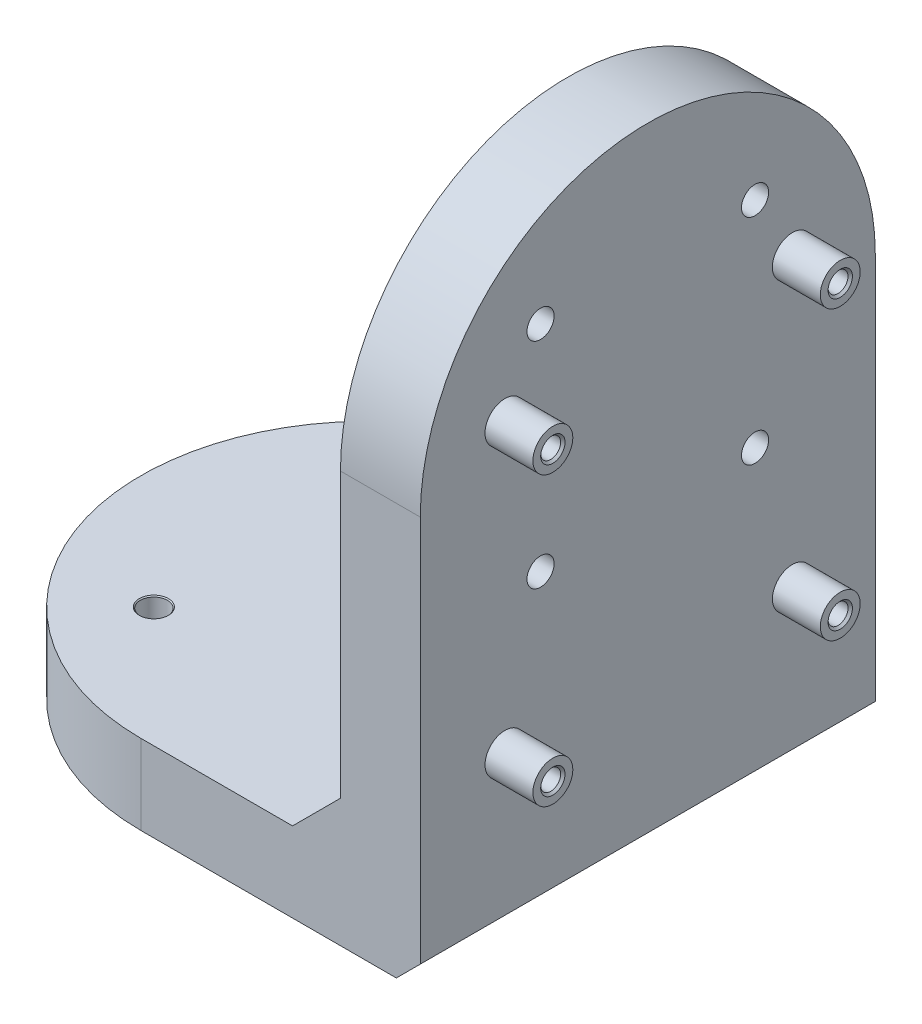
ISO-10303-21;
HEADER;
FILE_DESCRIPTION(('STEP AP214'),'2;1');
FILE_NAME('part.step','',(''),(''),'','','');
FILE_SCHEMA(('AUTOMOTIVE_DESIGN { 1 0 10303 214 1 1 1 1 }'));
ENDSEC;
DATA;
#1=APPLICATION_CONTEXT('core data for automotive mechanical design processes');
#2=APPLICATION_PROTOCOL_DEFINITION('international standard','automotive_design',2000,#1);
#3=PRODUCT_CONTEXT('',#1,'mechanical');
#4=PRODUCT('Part','Part','',(#3));
#5=PRODUCT_RELATED_PRODUCT_CATEGORY('part','',(#4));
#6=PRODUCT_DEFINITION_FORMATION('','',#4);
#7=PRODUCT_DEFINITION_CONTEXT('part definition',#1,'design');
#8=PRODUCT_DEFINITION('design','',#6,#7);
#9=PRODUCT_DEFINITION_SHAPE('','',#8);
#10=(LENGTH_UNIT() NAMED_UNIT(*) SI_UNIT(.MILLI.,.METRE.));
#11=(NAMED_UNIT(*) PLANE_ANGLE_UNIT() SI_UNIT($,.RADIAN.));
#12=(NAMED_UNIT(*) SI_UNIT($,.STERADIAN.) SOLID_ANGLE_UNIT());
#13=UNCERTAINTY_MEASURE_WITH_UNIT(LENGTH_MEASURE(1.E-05),#10,'distance_accuracy_value','');
#14=(GEOMETRIC_REPRESENTATION_CONTEXT(3) GLOBAL_UNCERTAINTY_ASSIGNED_CONTEXT((#13)) GLOBAL_UNIT_ASSIGNED_CONTEXT((#10,
#11,#12)) REPRESENTATION_CONTEXT('',''));
#15=CARTESIAN_POINT('',(0.,0.,0.));
#16=DIRECTION('',(0.,0.,1.));
#17=DIRECTION('',(1.,0.,0.));
#18=AXIS2_PLACEMENT_3D('',#15,#16,#17);
#19=CARTESIAN_POINT('',(25.,80.,0.));
#20=DIRECTION('',(1.,0.,0.));
#21=DIRECTION('',(0.,0.,-1.));
#22=AXIS2_PLACEMENT_3D('',#19,#20,#21);
#23=PLANE('',#22);
#24=CARTESIAN_POINT('',(25.,38.0649711574556,-13.4350288425444));
#25=DIRECTION('',(-1.,0.,0.));
#26=DIRECTION('',(0.,0.,1.));
#27=AXIS2_PLACEMENT_3D('',#24,#25,#26);
#28=CIRCLE('',#27,1.825);
#29=CARTESIAN_POINT('',(25.,38.0649711574556,-11.6100288425444));
#30=VERTEX_POINT('',#29);
#31=EDGE_CURVE('E233',#30,#30,#28,.T.);
#32=ORIENTED_EDGE('',*,*,#31,.F.);
#33=EDGE_LOOP('',(#32));
#34=FACE_BOUND('',#33,.T.);
#35=CARTESIAN_POINT('',(25.,64.9350288425443,-13.4350288425445));
#36=DIRECTION('',(-1.,0.,0.));
#37=DIRECTION('',(0.,0.,1.));
#38=AXIS2_PLACEMENT_3D('',#35,#36,#37);
#39=CIRCLE('',#38,1.82500000000001);
#40=CARTESIAN_POINT('',(25.,64.9350288425443,-11.6100288425445));
#41=VERTEX_POINT('',#40);
#42=EDGE_CURVE('E245',#41,#41,#39,.T.);
#43=ORIENTED_EDGE('',*,*,#42,.F.);
#44=EDGE_LOOP('',(#43));
#45=FACE_BOUND('',#44,.T.);
#46=CARTESIAN_POINT('',(25.,64.9350288425444,13.4350288425444));
#47=DIRECTION('',(-1.,0.,0.));
#48=DIRECTION('',(0.,0.,1.));
#49=AXIS2_PLACEMENT_3D('',#46,#47,#48);
#50=CIRCLE('',#49,1.82499999999999);
#51=CARTESIAN_POINT('',(25.,64.9350288425444,15.2600288425444));
#52=VERTEX_POINT('',#51);
#53=EDGE_CURVE('E257',#52,#52,#50,.T.);
#54=ORIENTED_EDGE('',*,*,#53,.F.);
#55=EDGE_LOOP('',(#54));
#56=FACE_BOUND('',#55,.T.);
#57=DIRECTION('',(0.,-1.,0.));
#58=VECTOR('',#57,1.);
#59=CARTESIAN_POINT('',(25.,80.,-28.5));
#60=LINE('',#59,#58);
#61=CARTESIAN_POINT('',(25.,51.5,-28.5));
#62=VERTEX_POINT('',#61);
#63=CARTESIAN_POINT('',(25.,16.0000000000001,-28.5));
#64=VERTEX_POINT('',#63);
#65=EDGE_CURVE('E342',#62,#64,#60,.T.);
#66=ORIENTED_EDGE('',*,*,#65,.T.);
#67=DIRECTION('',(0.,0.,1.));
#68=VECTOR('',#67,1.);
#69=CARTESIAN_POINT('',(25.,16.0000000000001,0.));
#70=LINE('',#69,#68);
#71=CARTESIAN_POINT('',(25.,16.0000000000001,28.5));
#72=VERTEX_POINT('',#71);
#73=EDGE_CURVE('E387',#64,#72,#70,.T.);
#74=ORIENTED_EDGE('',*,*,#73,.T.);
#75=DIRECTION('',(0.,-1.,0.));
#76=VECTOR('',#75,1.);
#77=CARTESIAN_POINT('',(25.,80.,28.5));
#78=LINE('',#77,#76);
#79=CARTESIAN_POINT('',(25.,51.5,28.5));
#80=VERTEX_POINT('',#79);
#81=EDGE_CURVE('E339',#80,#72,#78,.T.);
#82=ORIENTED_EDGE('',*,*,#81,.F.);
#83=CARTESIAN_POINT('',(25.,51.5,0.));
#84=DIRECTION('',(-1.,0.,0.));
#85=DIRECTION('',(0.,0.,1.));
#86=AXIS2_PLACEMENT_3D('',#83,#84,#85);
#87=CIRCLE('',#86,28.5);
#88=EDGE_CURVE('E276',#80,#62,#87,.T.);
#89=ORIENTED_EDGE('',*,*,#88,.T.);
#90=EDGE_LOOP('',(#66,#74,#82,#89));
#91=FACE_BOUND('',#90,.T.);
#92=CARTESIAN_POINT('',(25.,38.0649711574558,13.4350288425446));
#93=DIRECTION('',(-1.,0.,0.));
#94=DIRECTION('',(0.,0.,1.));
#95=AXIS2_PLACEMENT_3D('',#92,#93,#94);
#96=CIRCLE('',#95,1.825);
#97=CARTESIAN_POINT('',(25.,38.0649711574558,15.2600288425446));
#98=VERTEX_POINT('',#97);
#99=EDGE_CURVE('E218',#98,#98,#96,.T.);
#100=ORIENTED_EDGE('',*,*,#99,.F.);
#101=EDGE_LOOP('',(#100));
#102=FACE_BOUND('',#101,.T.);
#103=ADVANCED_FACE('F58',(#34,#45,#56,#91,#102),#23,.F.);
#104=CARTESIAN_POINT('',(35.,80.,0.));
#105=DIRECTION('',(1.,0.,0.));
#106=DIRECTION('',(0.,0.,-1.));
#107=AXIS2_PLACEMENT_3D('',#104,#105,#106);
#108=PLANE('',#107);
#109=CARTESIAN_POINT('',(35.,20.5570503949516,17.8917145880082));
#110=DIRECTION('',(1.,0.,0.));
#111=DIRECTION('',(0.,0.,-1.));
#112=AXIS2_PLACEMENT_3D('',#109,#110,#111);
#113=CIRCLE('',#112,2.5);
#114=CARTESIAN_POINT('',(35.,20.5570503949516,15.3917145880082));
#115=VERTEX_POINT('',#114);
#116=EDGE_CURVE('E190',#115,#115,#113,.T.);
#117=ORIENTED_EDGE('',*,*,#116,.F.);
#118=EDGE_LOOP('',(#117));
#119=FACE_BOUND('',#118,.T.);
#120=CARTESIAN_POINT('',(35.,20.5570503949516,-18.1082854119918));
#121=DIRECTION('',(1.,0.,0.));
#122=DIRECTION('',(0.,0.,-1.));
#123=AXIS2_PLACEMENT_3D('',#120,#121,#122);
#124=CIRCLE('',#123,2.5);
#125=CARTESIAN_POINT('',(35.,20.5570503949516,-20.6082854119918));
#126=VERTEX_POINT('',#125);
#127=EDGE_CURVE('E198',#126,#126,#124,.T.);
#128=ORIENTED_EDGE('',*,*,#127,.F.);
#129=EDGE_LOOP('',(#128));
#130=FACE_BOUND('',#129,.T.);
#131=CARTESIAN_POINT('',(35.,56.5570503949516,-18.1082854119914));
#132=DIRECTION('',(1.,0.,0.));
#133=DIRECTION('',(0.,0.,-1.));
#134=AXIS2_PLACEMENT_3D('',#131,#132,#133);
#135=CIRCLE('',#134,2.5);
#136=CARTESIAN_POINT('',(35.,56.5570503949516,-20.6082854119914));
#137=VERTEX_POINT('',#136);
#138=EDGE_CURVE('E206',#137,#137,#135,.T.);
#139=ORIENTED_EDGE('',*,*,#138,.F.);
#140=EDGE_LOOP('',(#139));
#141=FACE_BOUND('',#140,.T.);
#142=CARTESIAN_POINT('',(35.,56.5570503949516,17.8917145880085));
#143=DIRECTION('',(1.,0.,0.));
#144=DIRECTION('',(0.,0.,-1.));
#145=AXIS2_PLACEMENT_3D('',#142,#143,#144);
#146=CIRCLE('',#145,2.5);
#147=CARTESIAN_POINT('',(35.,56.5570503949516,15.3917145880085));
#148=VERTEX_POINT('',#147);
#149=EDGE_CURVE('E210',#148,#148,#146,.T.);
#150=ORIENTED_EDGE('',*,*,#149,.F.);
#151=EDGE_LOOP('',(#150));
#152=FACE_BOUND('',#151,.T.);
#153=CARTESIAN_POINT('',(35.,38.0649711574558,13.4350288425446));
#154=DIRECTION('',(1.,0.,0.));
#155=DIRECTION('',(0.,0.,-1.));
#156=AXIS2_PLACEMENT_3D('',#153,#154,#155);
#157=CIRCLE('',#156,1.69999999999999);
#158=CARTESIAN_POINT('',(35.,38.0649711574558,11.7350288425446));
#159=VERTEX_POINT('',#158);
#160=EDGE_CURVE('E229',#159,#159,#157,.T.);
#161=ORIENTED_EDGE('',*,*,#160,.F.);
#162=EDGE_LOOP('',(#161));
#163=FACE_BOUND('',#162,.T.);
#164=CARTESIAN_POINT('',(35.,38.0649711574556,-13.4350288425444));
#165=DIRECTION('',(1.,0.,0.));
#166=DIRECTION('',(0.,0.,-1.));
#167=AXIS2_PLACEMENT_3D('',#164,#165,#166);
#168=CIRCLE('',#167,1.69999999999999);
#169=CARTESIAN_POINT('',(35.,38.0649711574556,-15.1350288425444));
#170=VERTEX_POINT('',#169);
#171=EDGE_CURVE('E241',#170,#170,#168,.T.);
#172=ORIENTED_EDGE('',*,*,#171,.F.);
#173=EDGE_LOOP('',(#172));
#174=FACE_BOUND('',#173,.T.);
#175=CARTESIAN_POINT('',(35.,64.9350288425443,-13.4350288425445));
#176=DIRECTION('',(1.,0.,0.));
#177=DIRECTION('',(0.,0.,-1.));
#178=AXIS2_PLACEMENT_3D('',#175,#176,#177);
#179=CIRCLE('',#178,1.69999999999999);
#180=CARTESIAN_POINT('',(35.,64.9350288425443,-15.1350288425445));
#181=VERTEX_POINT('',#180);
#182=EDGE_CURVE('E253',#181,#181,#179,.T.);
#183=ORIENTED_EDGE('',*,*,#182,.F.);
#184=EDGE_LOOP('',(#183));
#185=FACE_BOUND('',#184,.T.);
#186=CARTESIAN_POINT('',(35.,64.9350288425444,13.4350288425444));
#187=DIRECTION('',(1.,0.,0.));
#188=DIRECTION('',(0.,0.,-1.));
#189=AXIS2_PLACEMENT_3D('',#186,#187,#188);
#190=CIRCLE('',#189,1.69999999999999);
#191=CARTESIAN_POINT('',(35.,64.9350288425444,11.7350288425444));
#192=VERTEX_POINT('',#191);
#193=EDGE_CURVE('E265',#192,#192,#190,.T.);
#194=ORIENTED_EDGE('',*,*,#193,.F.);
#195=EDGE_LOOP('',(#194));
#196=FACE_BOUND('',#195,.T.);
#197=DIRECTION('',(0.,-1.,0.));
#198=VECTOR('',#197,1.);
#199=CARTESIAN_POINT('',(35.,80.,28.5));
#200=LINE('',#199,#198);
#201=CARTESIAN_POINT('',(35.,51.5,28.5));
#202=VERTEX_POINT('',#201);
#203=CARTESIAN_POINT('',(35.,3.00000000000003,28.5));
#204=VERTEX_POINT('',#203);
#205=EDGE_CURVE('E335',#202,#204,#200,.T.);
#206=ORIENTED_EDGE('',*,*,#205,.T.);
#207=DIRECTION('',(0.,0.,-1.));
#208=VECTOR('',#207,1.);
#209=CARTESIAN_POINT('',(35.,3.00000000000003,-28.5));
#210=LINE('',#209,#208);
#211=CARTESIAN_POINT('',(35.,3.00000000000003,-28.5));
#212=VERTEX_POINT('',#211);
#213=EDGE_CURVE('E381',#204,#212,#210,.T.);
#214=ORIENTED_EDGE('',*,*,#213,.T.);
#215=DIRECTION('',(0.,-1.,0.));
#216=VECTOR('',#215,1.);
#217=CARTESIAN_POINT('',(35.,80.,-28.5));
#218=LINE('',#217,#216);
#219=CARTESIAN_POINT('',(35.,51.5,-28.5));
#220=VERTEX_POINT('',#219);
#221=EDGE_CURVE('E331',#220,#212,#218,.T.);
#222=ORIENTED_EDGE('',*,*,#221,.F.);
#223=CARTESIAN_POINT('',(35.,51.5,0.));
#224=DIRECTION('',(1.,0.,0.));
#225=DIRECTION('',(0.,0.,-1.));
#226=AXIS2_PLACEMENT_3D('',#223,#224,#225);
#227=CIRCLE('',#226,28.5);
#228=EDGE_CURVE('E273',#202,#220,#227,.F.);
#229=ORIENTED_EDGE('',*,*,#228,.F.);
#230=EDGE_LOOP('',(#206,#214,#222,#229));
#231=FACE_BOUND('',#230,.T.);
#232=ADVANCED_FACE('F424',(#119,#130,#141,#152,#163,#174,#185,#196,#231),#108,.T.);
#233=CARTESIAN_POINT('',(0.,10.,28.5));
#234=DIRECTION('',(0.,0.,1.));
#235=DIRECTION('',(1.,0.,0.));
#236=AXIS2_PLACEMENT_3D('',#233,#234,#235);
#237=PLANE('',#236);
#238=DIRECTION('',(-1.,0.,0.));
#239=VECTOR('',#238,1.);
#240=CARTESIAN_POINT('',(0.,0.,28.5));
#241=LINE('',#240,#239);
#242=CARTESIAN_POINT('',(32.,0.,28.5));
#243=VERTEX_POINT('',#242);
#244=CARTESIAN_POINT('',(0.,0.,28.5));
#245=VERTEX_POINT('',#244);
#246=EDGE_CURVE('E351',#243,#245,#241,.T.);
#247=ORIENTED_EDGE('',*,*,#246,.F.);
#248=DIRECTION('',(0.707106781186544,0.707106781186551,0.));
#249=VECTOR('',#248,1.);
#250=CARTESIAN_POINT('',(21.0000000000001,-10.9999999999999,28.5));
#251=LINE('',#250,#249);
#252=EDGE_CURVE('E378',#243,#204,#251,.T.);
#253=ORIENTED_EDGE('',*,*,#252,.T.);
#254=ORIENTED_EDGE('',*,*,#205,.F.);
#255=DIRECTION('',(-1.,0.,0.));
#256=VECTOR('',#255,1.);
#257=CARTESIAN_POINT('',(35.001,51.5,28.5));
#258=LINE('',#257,#256);
#259=EDGE_CURVE('E269',#202,#80,#258,.T.);
#260=ORIENTED_EDGE('',*,*,#259,.T.);
#261=ORIENTED_EDGE('',*,*,#81,.T.);
#262=DIRECTION('',(-0.707106781186542,-0.707106781186553,0.));
#263=VECTOR('',#262,1.);
#264=CARTESIAN_POINT('',(25.,16.0000000000001,28.5));
#265=LINE('',#264,#263);
#266=CARTESIAN_POINT('',(19.,10.,28.5));
#267=VERTEX_POINT('',#266);
#268=EDGE_CURVE('E68',#72,#267,#265,.T.);
#269=ORIENTED_EDGE('',*,*,#268,.T.);
#270=DIRECTION('',(-1.,0.,0.));
#271=VECTOR('',#270,1.);
#272=CARTESIAN_POINT('',(0.,10.,28.5));
#273=LINE('',#272,#271);
#274=CARTESIAN_POINT('',(0.,10.,28.5));
#275=VERTEX_POINT('',#274);
#276=EDGE_CURVE('E355',#267,#275,#273,.T.);
#277=ORIENTED_EDGE('',*,*,#276,.T.);
#278=DIRECTION('',(0.,-1.,0.));
#279=VECTOR('',#278,1.);
#280=CARTESIAN_POINT('',(0.,10.,28.5));
#281=LINE('',#280,#279);
#282=EDGE_CURVE('E358',#275,#245,#281,.T.);
#283=ORIENTED_EDGE('',*,*,#282,.T.);
#284=EDGE_LOOP('',(#247,#253,#254,#260,#261,#269,#277,#283));
#285=FACE_BOUND('',#284,.T.);
#286=ADVANCED_FACE('F401',(#285),#237,.T.);
#287=CARTESIAN_POINT('',(0.,10.,-28.5));
#288=DIRECTION('',(0.,0.,-1.));
#289=DIRECTION('',(-1.,0.,0.));
#290=AXIS2_PLACEMENT_3D('',#287,#288,#289);
#291=PLANE('',#290);
#292=ORIENTED_EDGE('',*,*,#221,.T.);
#293=DIRECTION('',(-0.707106781186544,-0.707106781186551,0.));
#294=VECTOR('',#293,1.);
#295=CARTESIAN_POINT('',(21.0000000000001,-10.9999999999999,-28.5));
#296=LINE('',#295,#294);
#297=CARTESIAN_POINT('',(32.,0.,-28.5));
#298=VERTEX_POINT('',#297);
#299=EDGE_CURVE('E384',#212,#298,#296,.T.);
#300=ORIENTED_EDGE('',*,*,#299,.T.);
#301=DIRECTION('',(1.,0.,0.));
#302=VECTOR('',#301,1.);
#303=CARTESIAN_POINT('',(0.,0.,-28.5));
#304=LINE('',#303,#302);
#305=CARTESIAN_POINT('',(0.,0.,-28.5));
#306=VERTEX_POINT('',#305);
#307=EDGE_CURVE('E346',#306,#298,#304,.T.);
#308=ORIENTED_EDGE('',*,*,#307,.F.);
#309=DIRECTION('',(0.,-1.,0.));
#310=VECTOR('',#309,1.);
#311=CARTESIAN_POINT('',(0.,10.,-28.5));
#312=LINE('',#311,#310);
#313=CARTESIAN_POINT('',(0.,10.,-28.5));
#314=VERTEX_POINT('',#313);
#315=EDGE_CURVE('E371',#314,#306,#312,.T.);
#316=ORIENTED_EDGE('',*,*,#315,.F.);
#317=DIRECTION('',(1.,0.,0.));
#318=VECTOR('',#317,1.);
#319=CARTESIAN_POINT('',(0.,10.,-28.5));
#320=LINE('',#319,#318);
#321=CARTESIAN_POINT('',(19.,10.,-28.5));
#322=VERTEX_POINT('',#321);
#323=EDGE_CURVE('E347',#314,#322,#320,.T.);
#324=ORIENTED_EDGE('',*,*,#323,.T.);
#325=DIRECTION('',(0.707106781186542,0.707106781186553,0.));
#326=VECTOR('',#325,1.);
#327=CARTESIAN_POINT('',(25.,16.0000000000001,-28.5));
#328=LINE('',#327,#326);
#329=EDGE_CURVE('E11',#322,#64,#328,.T.);
#330=ORIENTED_EDGE('',*,*,#329,.T.);
#331=ORIENTED_EDGE('',*,*,#65,.F.);
#332=DIRECTION('',(-1.,0.,0.));
#333=VECTOR('',#332,1.);
#334=CARTESIAN_POINT('',(35.001,51.5,-28.5));
#335=LINE('',#334,#333);
#336=EDGE_CURVE('E280',#220,#62,#335,.T.);
#337=ORIENTED_EDGE('',*,*,#336,.F.);
#338=EDGE_LOOP('',(#292,#300,#308,#316,#324,#330,#331,#337));
#339=FACE_BOUND('',#338,.T.);
#340=ADVANCED_FACE('F408',(#339),#291,.T.);
#341=CARTESIAN_POINT('',(0.,10.,0.));
#342=DIRECTION('',(0.,-1.,0.));
#343=DIRECTION('',(0.,0.,-1.));
#344=AXIS2_PLACEMENT_3D('',#341,#342,#343);
#345=CYLINDRICAL_SURFACE('',#344,28.5);
#346=CARTESIAN_POINT('',(0.,0.,0.));
#347=DIRECTION('',(0.,1.,0.));
#348=DIRECTION('',(0.,0.,1.));
#349=AXIS2_PLACEMENT_3D('',#346,#347,#348);
#350=CIRCLE('',#349,28.5);
#351=EDGE_CURVE('E362',#306,#245,#350,.T.);
#352=ORIENTED_EDGE('',*,*,#351,.T.);
#353=ORIENTED_EDGE('',*,*,#282,.F.);
#354=CARTESIAN_POINT('',(0.,10.,0.));
#355=DIRECTION('',(0.,1.,0.));
#356=DIRECTION('',(0.,0.,1.));
#357=AXIS2_PLACEMENT_3D('',#354,#355,#356);
#358=CIRCLE('',#357,28.5);
#359=EDGE_CURVE('E350',#314,#275,#358,.T.);
#360=ORIENTED_EDGE('',*,*,#359,.F.);
#361=ORIENTED_EDGE('',*,*,#315,.T.);
#362=EDGE_LOOP('',(#352,#353,#360,#361));
#363=FACE_BOUND('',#362,.T.);
#364=ADVANCED_FACE('F439',(#363),#345,.T.);
#365=CARTESIAN_POINT('',(0.,10.,0.));
#366=DIRECTION('',(0.,1.,0.));
#367=DIRECTION('',(0.,0.,1.));
#368=AXIS2_PLACEMENT_3D('',#365,#366,#367);
#369=PLANE('',#368);
#370=CARTESIAN_POINT('',(13.4350288425444,10.,-13.4350288425444));
#371=DIRECTION('',(0.,1.,0.));
#372=DIRECTION('',(0.,0.,1.));
#373=AXIS2_PLACEMENT_3D('',#370,#371,#372);
#374=CIRCLE('',#373,1.825);
#375=CARTESIAN_POINT('',(13.4350288425444,10.,-11.6100288425444));
#376=VERTEX_POINT('',#375);
#377=EDGE_CURVE('E283',#376,#376,#374,.T.);
#378=ORIENTED_EDGE('',*,*,#377,.F.);
#379=EDGE_LOOP('',(#378));
#380=FACE_BOUND('',#379,.T.);
#381=CARTESIAN_POINT('',(13.4350288425452,10.,13.4350288425444));
#382=DIRECTION('',(0.,1.,0.));
#383=DIRECTION('',(0.,0.,1.));
#384=AXIS2_PLACEMENT_3D('',#381,#382,#383);
#385=CIRCLE('',#384,1.825);
#386=CARTESIAN_POINT('',(13.4350288425452,10.,15.2600288425444));
#387=VERTEX_POINT('',#386);
#388=EDGE_CURVE('E295',#387,#387,#385,.T.);
#389=ORIENTED_EDGE('',*,*,#388,.F.);
#390=EDGE_LOOP('',(#389));
#391=FACE_BOUND('',#390,.T.);
#392=CARTESIAN_POINT('',(-13.4350288425436,10.,13.4350288425452));
#393=DIRECTION('',(0.,1.,0.));
#394=DIRECTION('',(0.,0.,1.));
#395=AXIS2_PLACEMENT_3D('',#392,#393,#394);
#396=CIRCLE('',#395,1.825);
#397=CARTESIAN_POINT('',(-13.4350288425436,10.,15.2600288425452));
#398=VERTEX_POINT('',#397);
#399=EDGE_CURVE('E307',#398,#398,#396,.T.);
#400=ORIENTED_EDGE('',*,*,#399,.F.);
#401=EDGE_LOOP('',(#400));
#402=FACE_BOUND('',#401,.T.);
#403=CARTESIAN_POINT('',(-13.4350288425444,10.,-13.4350288425436));
#404=DIRECTION('',(0.,1.,0.));
#405=DIRECTION('',(0.,0.,1.));
#406=AXIS2_PLACEMENT_3D('',#403,#404,#405);
#407=CIRCLE('',#406,1.825);
#408=CARTESIAN_POINT('',(-13.4350288425444,10.,-11.6100288425436));
#409=VERTEX_POINT('',#408);
#410=EDGE_CURVE('E319',#409,#409,#407,.T.);
#411=ORIENTED_EDGE('',*,*,#410,.F.);
#412=EDGE_LOOP('',(#411));
#413=FACE_BOUND('',#412,.T.);
#414=ORIENTED_EDGE('',*,*,#276,.F.);
#415=DIRECTION('',(0.,0.,-1.));
#416=VECTOR('',#415,1.);
#417=CARTESIAN_POINT('',(19.,10.,0.));
#418=LINE('',#417,#416);
#419=EDGE_CURVE('E81',#267,#322,#418,.T.);
#420=ORIENTED_EDGE('',*,*,#419,.T.);
#421=ORIENTED_EDGE('',*,*,#323,.F.);
#422=ORIENTED_EDGE('',*,*,#359,.T.);
#423=EDGE_LOOP('',(#414,#420,#421,#422));
#424=FACE_BOUND('',#423,.T.);
#425=ADVANCED_FACE('F436',(#380,#391,#402,#413,#424),#369,.T.);
#426=CARTESIAN_POINT('',(0.,0.,0.));
#427=DIRECTION('',(0.,1.,0.));
#428=DIRECTION('',(0.,0.,1.));
#429=AXIS2_PLACEMENT_3D('',#426,#427,#428);
#430=PLANE('',#429);
#431=CARTESIAN_POINT('',(13.4350288425444,0.,-13.4350288425444));
#432=DIRECTION('',(0.,1.,0.));
#433=DIRECTION('',(0.,0.,1.));
#434=AXIS2_PLACEMENT_3D('',#431,#432,#433);
#435=CIRCLE('',#434,1.69999999999999);
#436=CARTESIAN_POINT('',(13.4350288425444,0.,-11.7350288425444));
#437=VERTEX_POINT('',#436);
#438=EDGE_CURVE('E291',#437,#437,#435,.T.);
#439=ORIENTED_EDGE('',*,*,#438,.T.);
#440=EDGE_LOOP('',(#439));
#441=FACE_BOUND('',#440,.T.);
#442=CARTESIAN_POINT('',(13.4350288425452,0.,13.4350288425444));
#443=DIRECTION('',(0.,1.,0.));
#444=DIRECTION('',(0.,0.,1.));
#445=AXIS2_PLACEMENT_3D('',#442,#443,#444);
#446=CIRCLE('',#445,1.69999999999999);
#447=CARTESIAN_POINT('',(13.4350288425452,0.,15.1350288425444));
#448=VERTEX_POINT('',#447);
#449=EDGE_CURVE('E303',#448,#448,#446,.T.);
#450=ORIENTED_EDGE('',*,*,#449,.T.);
#451=EDGE_LOOP('',(#450));
#452=FACE_BOUND('',#451,.T.);
#453=CARTESIAN_POINT('',(-13.4350288425436,0.,13.4350288425452));
#454=DIRECTION('',(0.,1.,0.));
#455=DIRECTION('',(0.,0.,1.));
#456=AXIS2_PLACEMENT_3D('',#453,#454,#455);
#457=CIRCLE('',#456,1.69999999999999);
#458=CARTESIAN_POINT('',(-13.4350288425436,0.,15.1350288425452));
#459=VERTEX_POINT('',#458);
#460=EDGE_CURVE('E315',#459,#459,#457,.T.);
#461=ORIENTED_EDGE('',*,*,#460,.T.);
#462=EDGE_LOOP('',(#461));
#463=FACE_BOUND('',#462,.T.);
#464=CARTESIAN_POINT('',(-13.4350288425444,0.,-13.4350288425436));
#465=DIRECTION('',(0.,1.,0.));
#466=DIRECTION('',(0.,0.,1.));
#467=AXIS2_PLACEMENT_3D('',#464,#465,#466);
#468=CIRCLE('',#467,1.69999999999999);
#469=CARTESIAN_POINT('',(-13.4350288425444,0.,-11.7350288425436));
#470=VERTEX_POINT('',#469);
#471=EDGE_CURVE('E327',#470,#470,#468,.T.);
#472=ORIENTED_EDGE('',*,*,#471,.T.);
#473=EDGE_LOOP('',(#472));
#474=FACE_BOUND('',#473,.T.);
#475=ORIENTED_EDGE('',*,*,#307,.T.);
#476=DIRECTION('',(0.,0.,1.));
#477=VECTOR('',#476,1.);
#478=CARTESIAN_POINT('',(32.,0.,28.5));
#479=LINE('',#478,#477);
#480=EDGE_CURVE('E374',#298,#243,#479,.T.);
#481=ORIENTED_EDGE('',*,*,#480,.T.);
#482=ORIENTED_EDGE('',*,*,#246,.T.);
#483=ORIENTED_EDGE('',*,*,#351,.F.);
#484=EDGE_LOOP('',(#475,#481,#482,#483));
#485=FACE_BOUND('',#484,.T.);
#486=ADVANCED_FACE('F438',(#441,#452,#463,#474,#485),#430,.F.);
#487=CARTESIAN_POINT('',(-13.4350288425444,10.,-13.4350288425436));
#488=DIRECTION('',(0.,1.,0.));
#489=DIRECTION('',(0.,0.,1.));
#490=AXIS2_PLACEMENT_3D('',#487,#488,#489);
#491=CYLINDRICAL_SURFACE('',#490,1.69999999999999);
#492=ORIENTED_EDGE('',*,*,#471,.F.);
#493=EDGE_LOOP('',(#492));
#494=FACE_BOUND('',#493,.T.);
#495=CARTESIAN_POINT('',(-13.4350288425444,9.87499999999999,-13.4350288425436));
#496=DIRECTION('',(0.,1.,0.));
#497=DIRECTION('',(0.,0.,1.));
#498=AXIS2_PLACEMENT_3D('',#495,#496,#497);
#499=CIRCLE('',#498,1.69999999999999);
#500=CARTESIAN_POINT('',(-13.4350288425444,9.87499999999999,-11.7350288425436));
#501=VERTEX_POINT('',#500);
#502=EDGE_CURVE('E323',#501,#501,#499,.T.);
#503=ORIENTED_EDGE('',*,*,#502,.T.);
#504=EDGE_LOOP('',(#503));
#505=FACE_BOUND('',#504,.T.);
#506=ADVANCED_FACE('F443',(#494,#505),#491,.F.);
#507=CARTESIAN_POINT('',(-13.4350288425444,10.,-13.4350288425436));
#508=DIRECTION('',(0.,1.,0.));
#509=DIRECTION('',(0.,0.,1.));
#510=AXIS2_PLACEMENT_3D('',#507,#508,#509);
#511=CONICAL_SURFACE('',#510,1.825,0.785398163397434);
#512=ORIENTED_EDGE('',*,*,#502,.F.);
#513=EDGE_LOOP('',(#512));
#514=FACE_BOUND('',#513,.T.);
#515=ORIENTED_EDGE('',*,*,#410,.T.);
#516=EDGE_LOOP('',(#515));
#517=FACE_BOUND('',#516,.T.);
#518=ADVANCED_FACE('F489',(#514,#517),#511,.F.);
#519=CARTESIAN_POINT('',(-13.4350288425436,10.,13.4350288425452));
#520=DIRECTION('',(0.,1.,0.));
#521=DIRECTION('',(0.,0.,1.));
#522=AXIS2_PLACEMENT_3D('',#519,#520,#521);
#523=CYLINDRICAL_SURFACE('',#522,1.69999999999999);
#524=ORIENTED_EDGE('',*,*,#460,.F.);
#525=EDGE_LOOP('',(#524));
#526=FACE_BOUND('',#525,.T.);
#527=CARTESIAN_POINT('',(-13.4350288425436,9.87499999999999,13.4350288425452));
#528=DIRECTION('',(0.,1.,0.));
#529=DIRECTION('',(0.,0.,1.));
#530=AXIS2_PLACEMENT_3D('',#527,#528,#529);
#531=CIRCLE('',#530,1.69999999999999);
#532=CARTESIAN_POINT('',(-13.4350288425436,9.87499999999999,15.1350288425452));
#533=VERTEX_POINT('',#532);
#534=EDGE_CURVE('E311',#533,#533,#531,.T.);
#535=ORIENTED_EDGE('',*,*,#534,.T.);
#536=EDGE_LOOP('',(#535));
#537=FACE_BOUND('',#536,.T.);
#538=ADVANCED_FACE('F498',(#526,#537),#523,.F.);
#539=CARTESIAN_POINT('',(-13.4350288425436,10.,13.4350288425452));
#540=DIRECTION('',(0.,1.,0.));
#541=DIRECTION('',(0.,0.,1.));
#542=AXIS2_PLACEMENT_3D('',#539,#540,#541);
#543=CONICAL_SURFACE('',#542,1.825,0.785398163397434);
#544=ORIENTED_EDGE('',*,*,#534,.F.);
#545=EDGE_LOOP('',(#544));
#546=FACE_BOUND('',#545,.T.);
#547=ORIENTED_EDGE('',*,*,#399,.T.);
#548=EDGE_LOOP('',(#547));
#549=FACE_BOUND('',#548,.T.);
#550=ADVANCED_FACE('F508',(#546,#549),#543,.F.);
#551=CARTESIAN_POINT('',(13.4350288425452,10.,13.4350288425444));
#552=DIRECTION('',(0.,1.,0.));
#553=DIRECTION('',(0.,0.,1.));
#554=AXIS2_PLACEMENT_3D('',#551,#552,#553);
#555=CYLINDRICAL_SURFACE('',#554,1.69999999999999);
#556=ORIENTED_EDGE('',*,*,#449,.F.);
#557=EDGE_LOOP('',(#556));
#558=FACE_BOUND('',#557,.T.);
#559=CARTESIAN_POINT('',(13.4350288425452,9.87499999999999,13.4350288425444));
#560=DIRECTION('',(0.,1.,0.));
#561=DIRECTION('',(0.,0.,1.));
#562=AXIS2_PLACEMENT_3D('',#559,#560,#561);
#563=CIRCLE('',#562,1.69999999999999);
#564=CARTESIAN_POINT('',(13.4350288425452,9.87499999999999,15.1350288425444));
#565=VERTEX_POINT('',#564);
#566=EDGE_CURVE('E299',#565,#565,#563,.T.);
#567=ORIENTED_EDGE('',*,*,#566,.T.);
#568=EDGE_LOOP('',(#567));
#569=FACE_BOUND('',#568,.T.);
#570=ADVANCED_FACE('F518',(#558,#569),#555,.F.);
#571=CARTESIAN_POINT('',(13.4350288425452,10.,13.4350288425444));
#572=DIRECTION('',(0.,1.,0.));
#573=DIRECTION('',(0.,0.,1.));
#574=AXIS2_PLACEMENT_3D('',#571,#572,#573);
#575=CONICAL_SURFACE('',#574,1.825,0.785398163397434);
#576=ORIENTED_EDGE('',*,*,#566,.F.);
#577=EDGE_LOOP('',(#576));
#578=FACE_BOUND('',#577,.T.);
#579=ORIENTED_EDGE('',*,*,#388,.T.);
#580=EDGE_LOOP('',(#579));
#581=FACE_BOUND('',#580,.T.);
#582=ADVANCED_FACE('F528',(#578,#581),#575,.F.);
#583=CARTESIAN_POINT('',(13.4350288425444,10.,-13.4350288425444));
#584=DIRECTION('',(0.,1.,0.));
#585=DIRECTION('',(0.,0.,1.));
#586=AXIS2_PLACEMENT_3D('',#583,#584,#585);
#587=CYLINDRICAL_SURFACE('',#586,1.69999999999999);
#588=ORIENTED_EDGE('',*,*,#438,.F.);
#589=EDGE_LOOP('',(#588));
#590=FACE_BOUND('',#589,.T.);
#591=CARTESIAN_POINT('',(13.4350288425444,9.87499999999999,-13.4350288425444));
#592=DIRECTION('',(0.,1.,0.));
#593=DIRECTION('',(0.,0.,1.));
#594=AXIS2_PLACEMENT_3D('',#591,#592,#593);
#595=CIRCLE('',#594,1.69999999999999);
#596=CARTESIAN_POINT('',(13.4350288425444,9.87499999999999,-11.7350288425444));
#597=VERTEX_POINT('',#596);
#598=EDGE_CURVE('E287',#597,#597,#595,.T.);
#599=ORIENTED_EDGE('',*,*,#598,.T.);
#600=EDGE_LOOP('',(#599));
#601=FACE_BOUND('',#600,.T.);
#602=ADVANCED_FACE('F538',(#590,#601),#587,.F.);
#603=CARTESIAN_POINT('',(13.4350288425444,10.,-13.4350288425444));
#604=DIRECTION('',(0.,1.,0.));
#605=DIRECTION('',(0.,0.,1.));
#606=AXIS2_PLACEMENT_3D('',#603,#604,#605);
#607=CONICAL_SURFACE('',#606,1.825,0.785398163397434);
#608=ORIENTED_EDGE('',*,*,#598,.F.);
#609=EDGE_LOOP('',(#608));
#610=FACE_BOUND('',#609,.T.);
#611=ORIENTED_EDGE('',*,*,#377,.T.);
#612=EDGE_LOOP('',(#611));
#613=FACE_BOUND('',#612,.T.);
#614=ADVANCED_FACE('F548',(#610,#613),#607,.F.);
#615=CARTESIAN_POINT('',(35.001,51.5,0.));
#616=DIRECTION('',(-1.,0.,0.));
#617=DIRECTION('',(0.,0.,1.));
#618=AXIS2_PLACEMENT_3D('',#615,#616,#617);
#619=CYLINDRICAL_SURFACE('',#618,28.5);
#620=ORIENTED_EDGE('',*,*,#228,.T.);
#621=ORIENTED_EDGE('',*,*,#336,.T.);
#622=ORIENTED_EDGE('',*,*,#88,.F.);
#623=ORIENTED_EDGE('',*,*,#259,.F.);
#624=EDGE_LOOP('',(#620,#621,#622,#623));
#625=FACE_BOUND('',#624,.T.);
#626=ADVANCED_FACE('F405',(#625),#619,.T.);
#627=CARTESIAN_POINT('',(25.,64.9350288425444,13.4350288425444));
#628=DIRECTION('',(-1.,0.,0.));
#629=DIRECTION('',(0.,0.,1.));
#630=AXIS2_PLACEMENT_3D('',#627,#628,#629);
#631=CYLINDRICAL_SURFACE('',#630,1.69999999999999);
#632=CARTESIAN_POINT('',(25.125,64.9350288425444,13.4350288425444));
#633=DIRECTION('',(-1.,0.,0.));
#634=DIRECTION('',(0.,0.,1.));
#635=AXIS2_PLACEMENT_3D('',#632,#633,#634);
#636=CIRCLE('',#635,1.69999999999999);
#637=CARTESIAN_POINT('',(25.125,64.9350288425444,15.1350288425444));
#638=VERTEX_POINT('',#637);
#639=EDGE_CURVE('E261',#638,#638,#636,.T.);
#640=ORIENTED_EDGE('',*,*,#639,.T.);
#641=EDGE_LOOP('',(#640));
#642=FACE_BOUND('',#641,.T.);
#643=ORIENTED_EDGE('',*,*,#193,.T.);
#644=EDGE_LOOP('',(#643));
#645=FACE_BOUND('',#644,.T.);
#646=ADVANCED_FACE('F582',(#642,#645),#631,.F.);
#647=CARTESIAN_POINT('',(25.,64.9350288425444,13.4350288425444));
#648=DIRECTION('',(-1.,0.,0.));
#649=DIRECTION('',(0.,0.,1.));
#650=AXIS2_PLACEMENT_3D('',#647,#648,#649);
#651=CONICAL_SURFACE('',#650,1.82499999999999,0.785398163397379);
#652=ORIENTED_EDGE('',*,*,#639,.F.);
#653=EDGE_LOOP('',(#652));
#654=FACE_BOUND('',#653,.T.);
#655=ORIENTED_EDGE('',*,*,#53,.T.);
#656=EDGE_LOOP('',(#655));
#657=FACE_BOUND('',#656,.T.);
#658=ADVANCED_FACE('F422',(#654,#657),#651,.F.);
#659=CARTESIAN_POINT('',(32.,0.,0.));
#660=DIRECTION('',(0.707106781186551,-0.707106781186544,0.));
#661=DIRECTION('',(0.,0.,-1.));
#662=AXIS2_PLACEMENT_3D('',#659,#660,#661);
#663=PLANE('',#662);
#664=ORIENTED_EDGE('',*,*,#299,.F.);
#665=ORIENTED_EDGE('',*,*,#213,.F.);
#666=ORIENTED_EDGE('',*,*,#252,.F.);
#667=ORIENTED_EDGE('',*,*,#480,.F.);
#668=EDGE_LOOP('',(#664,#665,#666,#667));
#669=FACE_BOUND('',#668,.T.);
#670=ADVANCED_FACE('F412',(#669),#663,.T.);
#671=CARTESIAN_POINT('',(25.,16.0000000000001,0.));
#672=DIRECTION('',(0.707106781186553,-0.707106781186542,0.));
#673=DIRECTION('',(0.,0.,1.));
#674=AXIS2_PLACEMENT_3D('',#671,#672,#673);
#675=PLANE('',#674);
#676=ORIENTED_EDGE('',*,*,#329,.F.);
#677=ORIENTED_EDGE('',*,*,#419,.F.);
#678=ORIENTED_EDGE('',*,*,#268,.F.);
#679=ORIENTED_EDGE('',*,*,#73,.F.);
#680=EDGE_LOOP('',(#676,#677,#678,#679));
#681=FACE_BOUND('',#680,.T.);
#682=ADVANCED_FACE('F61',(#681),#675,.F.);
#683=CARTESIAN_POINT('',(25.,64.9350288425443,-13.4350288425445));
#684=DIRECTION('',(-1.,0.,0.));
#685=DIRECTION('',(0.,0.,1.));
#686=AXIS2_PLACEMENT_3D('',#683,#684,#685);
#687=CYLINDRICAL_SURFACE('',#686,1.69999999999999);
#688=CARTESIAN_POINT('',(25.125,64.9350288425443,-13.4350288425445));
#689=DIRECTION('',(-1.,0.,0.));
#690=DIRECTION('',(0.,0.,1.));
#691=AXIS2_PLACEMENT_3D('',#688,#689,#690);
#692=CIRCLE('',#691,1.69999999999999);
#693=CARTESIAN_POINT('',(25.125,64.9350288425443,-11.7350288425445));
#694=VERTEX_POINT('',#693);
#695=EDGE_CURVE('E249',#694,#694,#692,.T.);
#696=ORIENTED_EDGE('',*,*,#695,.T.);
#697=EDGE_LOOP('',(#696));
#698=FACE_BOUND('',#697,.T.);
#699=ORIENTED_EDGE('',*,*,#182,.T.);
#700=EDGE_LOOP('',(#699));
#701=FACE_BOUND('',#700,.T.);
#702=ADVANCED_FACE('F411',(#698,#701),#687,.F.);
#703=CARTESIAN_POINT('',(25.,64.9350288425443,-13.4350288425445));
#704=DIRECTION('',(-1.,0.,0.));
#705=DIRECTION('',(0.,0.,1.));
#706=AXIS2_PLACEMENT_3D('',#703,#704,#705);
#707=CONICAL_SURFACE('',#706,1.82500000000001,0.785398163397434);
#708=ORIENTED_EDGE('',*,*,#695,.F.);
#709=EDGE_LOOP('',(#708));
#710=FACE_BOUND('',#709,.T.);
#711=ORIENTED_EDGE('',*,*,#42,.T.);
#712=EDGE_LOOP('',(#711));
#713=FACE_BOUND('',#712,.T.);
#714=ADVANCED_FACE('F418',(#710,#713),#707,.F.);
#715=CARTESIAN_POINT('',(25.,38.0649711574556,-13.4350288425444));
#716=DIRECTION('',(-1.,0.,0.));
#717=DIRECTION('',(0.,0.,1.));
#718=AXIS2_PLACEMENT_3D('',#715,#716,#717);
#719=CYLINDRICAL_SURFACE('',#718,1.69999999999999);
#720=CARTESIAN_POINT('',(25.125,38.0649711574556,-13.4350288425444));
#721=DIRECTION('',(-1.,0.,0.));
#722=DIRECTION('',(0.,0.,1.));
#723=AXIS2_PLACEMENT_3D('',#720,#721,#722);
#724=CIRCLE('',#723,1.69999999999999);
#725=CARTESIAN_POINT('',(25.125,38.0649711574556,-11.7350288425444));
#726=VERTEX_POINT('',#725);
#727=EDGE_CURVE('E237',#726,#726,#724,.T.);
#728=ORIENTED_EDGE('',*,*,#727,.T.);
#729=EDGE_LOOP('',(#728));
#730=FACE_BOUND('',#729,.T.);
#731=ORIENTED_EDGE('',*,*,#171,.T.);
#732=EDGE_LOOP('',(#731));
#733=FACE_BOUND('',#732,.T.);
#734=ADVANCED_FACE('F631',(#730,#733),#719,.F.);
#735=CARTESIAN_POINT('',(25.,38.0649711574556,-13.4350288425444));
#736=DIRECTION('',(-1.,0.,0.));
#737=DIRECTION('',(0.,0.,1.));
#738=AXIS2_PLACEMENT_3D('',#735,#736,#737);
#739=CONICAL_SURFACE('',#738,1.825,0.785398163397434);
#740=ORIENTED_EDGE('',*,*,#727,.F.);
#741=EDGE_LOOP('',(#740));
#742=FACE_BOUND('',#741,.T.);
#743=ORIENTED_EDGE('',*,*,#31,.T.);
#744=EDGE_LOOP('',(#743));
#745=FACE_BOUND('',#744,.T.);
#746=ADVANCED_FACE('F641',(#742,#745),#739,.F.);
#747=CARTESIAN_POINT('',(25.,38.0649711574558,13.4350288425446));
#748=DIRECTION('',(-1.,0.,0.));
#749=DIRECTION('',(0.,0.,1.));
#750=AXIS2_PLACEMENT_3D('',#747,#748,#749);
#751=CYLINDRICAL_SURFACE('',#750,1.69999999999999);
#752=CARTESIAN_POINT('',(25.125,38.0649711574558,13.4350288425446));
#753=DIRECTION('',(-1.,0.,0.));
#754=DIRECTION('',(0.,0.,1.));
#755=AXIS2_PLACEMENT_3D('',#752,#753,#754);
#756=CIRCLE('',#755,1.69999999999999);
#757=CARTESIAN_POINT('',(25.125,38.0649711574558,15.1350288425445));
#758=VERTEX_POINT('',#757);
#759=EDGE_CURVE('E225',#758,#758,#756,.T.);
#760=ORIENTED_EDGE('',*,*,#759,.T.);
#761=EDGE_LOOP('',(#760));
#762=FACE_BOUND('',#761,.T.);
#763=ORIENTED_EDGE('',*,*,#160,.T.);
#764=EDGE_LOOP('',(#763));
#765=FACE_BOUND('',#764,.T.);
#766=ADVANCED_FACE('F651',(#762,#765),#751,.F.);
#767=CARTESIAN_POINT('',(25.,38.0649711574558,13.4350288425446));
#768=DIRECTION('',(-1.,0.,0.));
#769=DIRECTION('',(0.,0.,1.));
#770=AXIS2_PLACEMENT_3D('',#767,#768,#769);
#771=CONICAL_SURFACE('',#770,1.825,0.785398163397434);
#772=ORIENTED_EDGE('',*,*,#759,.F.);
#773=EDGE_LOOP('',(#772));
#774=FACE_BOUND('',#773,.T.);
#775=ORIENTED_EDGE('',*,*,#99,.T.);
#776=EDGE_LOOP('',(#775));
#777=FACE_BOUND('',#776,.T.);
#778=ADVANCED_FACE('F661',(#774,#777),#771,.F.);
#779=CARTESIAN_POINT('',(41.,56.5570503949516,17.8917145880085));
#780=DIRECTION('',(-1.,0.,0.));
#781=DIRECTION('',(0.,0.,1.));
#782=AXIS2_PLACEMENT_3D('',#779,#780,#781);
#783=CYLINDRICAL_SURFACE('',#782,2.5);
#784=CARTESIAN_POINT('',(41.,56.5570503949516,17.8917145880085));
#785=DIRECTION('',(1.,0.,0.));
#786=DIRECTION('',(0.,0.,-1.));
#787=AXIS2_PLACEMENT_3D('',#784,#785,#786);
#788=CIRCLE('',#787,2.5);
#789=CARTESIAN_POINT('',(41.,56.5570503949516,15.3917145880085));
#790=VERTEX_POINT('',#789);
#791=EDGE_CURVE('E214',#790,#790,#788,.T.);
#792=ORIENTED_EDGE('',*,*,#791,.F.);
#793=EDGE_LOOP('',(#792));
#794=FACE_BOUND('',#793,.T.);
#795=ORIENTED_EDGE('',*,*,#149,.T.);
#796=EDGE_LOOP('',(#795));
#797=FACE_BOUND('',#796,.T.);
#798=ADVANCED_FACE('F670',(#794,#797),#783,.T.);
#799=CARTESIAN_POINT('',(41.,56.5570503949516,17.8917145880085));
#800=DIRECTION('',(1.,0.,0.));
#801=DIRECTION('',(0.,0.,-1.));
#802=AXIS2_PLACEMENT_3D('',#799,#800,#801);
#803=PLANE('',#802);
#804=CARTESIAN_POINT('',(41.,56.5570503949516,17.8917145880085));
#805=DIRECTION('',(1.,0.,0.));
#806=DIRECTION('',(0.,0.,-1.));
#807=AXIS2_PLACEMENT_3D('',#804,#805,#806);
#808=CIRCLE('',#807,1.525);
#809=CARTESIAN_POINT('',(41.,56.5570503949516,16.3667145880085));
#810=VERTEX_POINT('',#809);
#811=EDGE_CURVE('E154',#810,#810,#808,.T.);
#812=ORIENTED_EDGE('',*,*,#811,.F.);
#813=EDGE_LOOP('',(#812));
#814=FACE_BOUND('',#813,.T.);
#815=ORIENTED_EDGE('',*,*,#791,.T.);
#816=EDGE_LOOP('',(#815));
#817=FACE_BOUND('',#816,.T.);
#818=ADVANCED_FACE('F679',(#814,#817),#803,.T.);
#819=CARTESIAN_POINT('',(41.,56.5570503949516,-18.1082854119914));
#820=DIRECTION('',(-1.,0.,0.));
#821=DIRECTION('',(0.,0.,1.));
#822=AXIS2_PLACEMENT_3D('',#819,#820,#821);
#823=CYLINDRICAL_SURFACE('',#822,2.5);
#824=CARTESIAN_POINT('',(41.,56.5570503949516,-18.1082854119914));
#825=DIRECTION('',(1.,0.,0.));
#826=DIRECTION('',(0.,0.,-1.));
#827=AXIS2_PLACEMENT_3D('',#824,#825,#826);
#828=CIRCLE('',#827,2.5);
#829=CARTESIAN_POINT('',(41.,56.5570503949516,-20.6082854119914));
#830=VERTEX_POINT('',#829);
#831=EDGE_CURVE('E202',#830,#830,#828,.T.);
#832=ORIENTED_EDGE('',*,*,#831,.F.);
#833=EDGE_LOOP('',(#832));
#834=FACE_BOUND('',#833,.T.);
#835=ORIENTED_EDGE('',*,*,#138,.T.);
#836=EDGE_LOOP('',(#835));
#837=FACE_BOUND('',#836,.T.);
#838=ADVANCED_FACE('F690',(#834,#837),#823,.T.);
#839=CARTESIAN_POINT('',(41.,56.5570503949516,-18.1082854119914));
#840=DIRECTION('',(1.,0.,0.));
#841=DIRECTION('',(0.,0.,-1.));
#842=AXIS2_PLACEMENT_3D('',#839,#840,#841);
#843=PLANE('',#842);
#844=CARTESIAN_POINT('',(41.,56.5570503949516,-18.1082854119914));
#845=DIRECTION('',(1.,0.,0.));
#846=DIRECTION('',(0.,0.,-1.));
#847=AXIS2_PLACEMENT_3D('',#844,#845,#846);
#848=CIRCLE('',#847,1.525);
#849=CARTESIAN_POINT('',(41.,56.5570503949516,-19.6332854119914));
#850=VERTEX_POINT('',#849);
#851=EDGE_CURVE('E145',#850,#850,#848,.T.);
#852=ORIENTED_EDGE('',*,*,#851,.F.);
#853=EDGE_LOOP('',(#852));
#854=FACE_BOUND('',#853,.T.);
#855=ORIENTED_EDGE('',*,*,#831,.T.);
#856=EDGE_LOOP('',(#855));
#857=FACE_BOUND('',#856,.T.);
#858=ADVANCED_FACE('F701',(#854,#857),#843,.T.);
#859=CARTESIAN_POINT('',(41.,20.5570503949516,-18.1082854119918));
#860=DIRECTION('',(-1.,0.,0.));
#861=DIRECTION('',(0.,0.,1.));
#862=AXIS2_PLACEMENT_3D('',#859,#860,#861);
#863=CYLINDRICAL_SURFACE('',#862,2.5);
#864=CARTESIAN_POINT('',(41.,20.5570503949516,-18.1082854119918));
#865=DIRECTION('',(1.,0.,0.));
#866=DIRECTION('',(0.,0.,-1.));
#867=AXIS2_PLACEMENT_3D('',#864,#865,#866);
#868=CIRCLE('',#867,2.5);
#869=CARTESIAN_POINT('',(41.,20.5570503949516,-20.6082854119918));
#870=VERTEX_POINT('',#869);
#871=EDGE_CURVE('E194',#870,#870,#868,.T.);
#872=ORIENTED_EDGE('',*,*,#871,.F.);
#873=EDGE_LOOP('',(#872));
#874=FACE_BOUND('',#873,.T.);
#875=ORIENTED_EDGE('',*,*,#127,.T.);
#876=EDGE_LOOP('',(#875));
#877=FACE_BOUND('',#876,.T.);
#878=ADVANCED_FACE('F711',(#874,#877),#863,.T.);
#879=CARTESIAN_POINT('',(41.,20.5570503949516,-18.1082854119918));
#880=DIRECTION('',(1.,0.,0.));
#881=DIRECTION('',(0.,0.,-1.));
#882=AXIS2_PLACEMENT_3D('',#879,#880,#881);
#883=PLANE('',#882);
#884=CARTESIAN_POINT('',(41.,20.5570503949516,-18.1082854119918));
#885=DIRECTION('',(1.,0.,0.));
#886=DIRECTION('',(0.,0.,-1.));
#887=AXIS2_PLACEMENT_3D('',#884,#885,#886);
#888=CIRCLE('',#887,1.525);
#889=CARTESIAN_POINT('',(41.,20.5570503949516,-19.6332854119918));
#890=VERTEX_POINT('',#889);
#891=EDGE_CURVE('E177',#890,#890,#888,.T.);
#892=ORIENTED_EDGE('',*,*,#891,.F.);
#893=EDGE_LOOP('',(#892));
#894=FACE_BOUND('',#893,.T.);
#895=ORIENTED_EDGE('',*,*,#871,.T.);
#896=EDGE_LOOP('',(#895));
#897=FACE_BOUND('',#896,.T.);
#898=ADVANCED_FACE('F721',(#894,#897),#883,.T.);
#899=CARTESIAN_POINT('',(41.,20.5570503949516,17.8917145880082));
#900=DIRECTION('',(-1.,0.,0.));
#901=DIRECTION('',(0.,0.,1.));
#902=AXIS2_PLACEMENT_3D('',#899,#900,#901);
#903=CYLINDRICAL_SURFACE('',#902,2.5);
#904=CARTESIAN_POINT('',(41.,20.5570503949516,17.8917145880082));
#905=DIRECTION('',(1.,0.,0.));
#906=DIRECTION('',(0.,0.,-1.));
#907=AXIS2_PLACEMENT_3D('',#904,#905,#906);
#908=CIRCLE('',#907,2.5);
#909=CARTESIAN_POINT('',(41.,20.5570503949516,15.3917145880082));
#910=VERTEX_POINT('',#909);
#911=EDGE_CURVE('E189',#910,#910,#908,.T.);
#912=ORIENTED_EDGE('',*,*,#911,.F.);
#913=EDGE_LOOP('',(#912));
#914=FACE_BOUND('',#913,.T.);
#915=ORIENTED_EDGE('',*,*,#116,.T.);
#916=EDGE_LOOP('',(#915));
#917=FACE_BOUND('',#916,.T.);
#918=ADVANCED_FACE('F730',(#914,#917),#903,.T.);
#919=CARTESIAN_POINT('',(41.,20.5570503949516,17.8917145880082));
#920=DIRECTION('',(1.,0.,0.));
#921=DIRECTION('',(0.,0.,-1.));
#922=AXIS2_PLACEMENT_3D('',#919,#920,#921);
#923=PLANE('',#922);
#924=CARTESIAN_POINT('',(41.,20.5570503949516,17.8917145880082));
#925=DIRECTION('',(1.,0.,0.));
#926=DIRECTION('',(0.,0.,-1.));
#927=AXIS2_PLACEMENT_3D('',#924,#925,#926);
#928=CIRCLE('',#927,1.525);
#929=CARTESIAN_POINT('',(41.,20.5570503949516,16.3667145880082));
#930=VERTEX_POINT('',#929);
#931=EDGE_CURVE('E165',#930,#930,#928,.T.);
#932=ORIENTED_EDGE('',*,*,#931,.F.);
#933=EDGE_LOOP('',(#932));
#934=FACE_BOUND('',#933,.T.);
#935=ORIENTED_EDGE('',*,*,#911,.T.);
#936=EDGE_LOOP('',(#935));
#937=FACE_BOUND('',#936,.T.);
#938=ADVANCED_FACE('F740',(#934,#937),#923,.T.);
#939=CARTESIAN_POINT('',(36.,20.5570503949516,-18.1082854119918));
#940=DIRECTION('',(1.,0.,0.));
#941=DIRECTION('',(0.,0.,-1.));
#942=AXIS2_PLACEMENT_3D('',#939,#940,#941);
#943=CONICAL_SURFACE('',#942,1.24999999999999,1.02974425867665);
#944=CARTESIAN_POINT('',(35.2489242262155,20.5570503949516,-18.1082854119918));
#945=VERTEX_POINT('',#944);
#946=VERTEX_LOOP('',#945);
#947=FACE_BOUND('',#946,.T.);
#948=CARTESIAN_POINT('',(36.,20.5570503949516,-18.1082854119918));
#949=DIRECTION('',(1.,0.,0.));
#950=DIRECTION('',(0.,0.,-1.));
#951=AXIS2_PLACEMENT_3D('',#948,#949,#950);
#952=CIRCLE('',#951,1.24999999999999);
#953=CARTESIAN_POINT('',(36.,20.5570503949516,-19.3582854119918));
#954=VERTEX_POINT('',#953);
#955=EDGE_CURVE('E185',#954,#954,#952,.T.);
#956=ORIENTED_EDGE('',*,*,#955,.T.);
#957=EDGE_LOOP('',(#956));
#958=FACE_BOUND('',#957,.T.);
#959=ADVANCED_FACE('F749',(#947,#958),#943,.F.);
#960=CARTESIAN_POINT('',(41.,20.5570503949516,-18.1082854119918));
#961=DIRECTION('',(1.,0.,0.));
#962=DIRECTION('',(0.,0.,-1.));
#963=AXIS2_PLACEMENT_3D('',#960,#961,#962);
#964=CYLINDRICAL_SURFACE('',#963,1.24999999999999);
#965=ORIENTED_EDGE('',*,*,#955,.F.);
#966=EDGE_LOOP('',(#965));
#967=FACE_BOUND('',#966,.T.);
#968=CARTESIAN_POINT('',(40.725,20.5570503949516,-18.1082854119918));
#969=DIRECTION('',(1.,0.,0.));
#970=DIRECTION('',(0.,0.,-1.));
#971=AXIS2_PLACEMENT_3D('',#968,#969,#970);
#972=CIRCLE('',#971,1.25);
#973=CARTESIAN_POINT('',(40.725,20.5570503949516,-19.3582854119918));
#974=VERTEX_POINT('',#973);
#975=EDGE_CURVE('E181',#974,#974,#972,.T.);
#976=ORIENTED_EDGE('',*,*,#975,.T.);
#977=EDGE_LOOP('',(#976));
#978=FACE_BOUND('',#977,.T.);
#979=ADVANCED_FACE('F759',(#967,#978),#964,.F.);
#980=CARTESIAN_POINT('',(41.,20.5570503949516,-18.1082854119918));
#981=DIRECTION('',(1.,0.,0.));
#982=DIRECTION('',(0.,0.,-1.));
#983=AXIS2_PLACEMENT_3D('',#980,#981,#982);
#984=CONICAL_SURFACE('',#983,1.525,0.785398163397448);
#985=ORIENTED_EDGE('',*,*,#975,.F.);
#986=EDGE_LOOP('',(#985));
#987=FACE_BOUND('',#986,.T.);
#988=ORIENTED_EDGE('',*,*,#891,.T.);
#989=EDGE_LOOP('',(#988));
#990=FACE_BOUND('',#989,.T.);
#991=ADVANCED_FACE('F770',(#987,#990),#984,.F.);
#992=CARTESIAN_POINT('',(36.,20.5570503949516,17.8917145880082));
#993=DIRECTION('',(1.,0.,0.));
#994=DIRECTION('',(0.,0.,-1.));
#995=AXIS2_PLACEMENT_3D('',#992,#993,#994);
#996=CONICAL_SURFACE('',#995,1.24999999999999,1.02974425867665);
#997=CARTESIAN_POINT('',(35.2489242262155,20.5570503949516,17.8917145880082));
#998=VERTEX_POINT('',#997);
#999=VERTEX_LOOP('',#998);
#1000=FACE_BOUND('',#999,.T.);
#1001=CARTESIAN_POINT('',(36.,20.5570503949516,17.8917145880082));
#1002=DIRECTION('',(1.,0.,0.));
#1003=DIRECTION('',(0.,0.,-1.));
#1004=AXIS2_PLACEMENT_3D('',#1001,#1002,#1003);
#1005=CIRCLE('',#1004,1.24999999999999);
#1006=CARTESIAN_POINT('',(36.,20.5570503949516,16.6417145880082));
#1007=VERTEX_POINT('',#1006);
#1008=EDGE_CURVE('E173',#1007,#1007,#1005,.T.);
#1009=ORIENTED_EDGE('',*,*,#1008,.T.);
#1010=EDGE_LOOP('',(#1009));
#1011=FACE_BOUND('',#1010,.T.);
#1012=ADVANCED_FACE('F781',(#1000,#1011),#996,.F.);
#1013=CARTESIAN_POINT('',(41.,20.5570503949516,17.8917145880082));
#1014=DIRECTION('',(1.,0.,0.));
#1015=DIRECTION('',(0.,0.,-1.));
#1016=AXIS2_PLACEMENT_3D('',#1013,#1014,#1015);
#1017=CYLINDRICAL_SURFACE('',#1016,1.24999999999999);
#1018=ORIENTED_EDGE('',*,*,#1008,.F.);
#1019=EDGE_LOOP('',(#1018));
#1020=FACE_BOUND('',#1019,.T.);
#1021=CARTESIAN_POINT('',(40.725,20.5570503949516,17.8917145880082));
#1022=DIRECTION('',(1.,0.,0.));
#1023=DIRECTION('',(0.,0.,-1.));
#1024=AXIS2_PLACEMENT_3D('',#1021,#1022,#1023);
#1025=CIRCLE('',#1024,1.25);
#1026=CARTESIAN_POINT('',(40.725,20.5570503949516,16.6417145880082));
#1027=VERTEX_POINT('',#1026);
#1028=EDGE_CURVE('E169',#1027,#1027,#1025,.T.);
#1029=ORIENTED_EDGE('',*,*,#1028,.T.);
#1030=EDGE_LOOP('',(#1029));
#1031=FACE_BOUND('',#1030,.T.);
#1032=ADVANCED_FACE('F791',(#1020,#1031),#1017,.F.);
#1033=CARTESIAN_POINT('',(41.,20.5570503949516,17.8917145880082));
#1034=DIRECTION('',(1.,0.,0.));
#1035=DIRECTION('',(0.,0.,-1.));
#1036=AXIS2_PLACEMENT_3D('',#1033,#1034,#1035);
#1037=CONICAL_SURFACE('',#1036,1.525,0.785398163397448);
#1038=ORIENTED_EDGE('',*,*,#1028,.F.);
#1039=EDGE_LOOP('',(#1038));
#1040=FACE_BOUND('',#1039,.T.);
#1041=ORIENTED_EDGE('',*,*,#931,.T.);
#1042=EDGE_LOOP('',(#1041));
#1043=FACE_BOUND('',#1042,.T.);
#1044=ADVANCED_FACE('F802',(#1040,#1043),#1037,.F.);
#1045=CARTESIAN_POINT('',(36.,56.5570503949516,-18.1082854119914));
#1046=DIRECTION('',(1.,0.,0.));
#1047=DIRECTION('',(0.,0.,-1.));
#1048=AXIS2_PLACEMENT_3D('',#1045,#1046,#1047);
#1049=CONICAL_SURFACE('',#1048,1.24999999999999,1.02974425867665);
#1050=CARTESIAN_POINT('',(35.2489242262155,56.5570503949516,-18.1082854119914));
#1051=VERTEX_POINT('',#1050);
#1052=VERTEX_LOOP('',#1051);
#1053=FACE_BOUND('',#1052,.T.);
#1054=CARTESIAN_POINT('',(36.,56.5570503949516,-18.1082854119914));
#1055=DIRECTION('',(1.,0.,0.));
#1056=DIRECTION('',(0.,0.,-1.));
#1057=AXIS2_PLACEMENT_3D('',#1054,#1055,#1056);
#1058=CIRCLE('',#1057,1.24999999999999);
#1059=CARTESIAN_POINT('',(36.,56.5570503949516,-19.3582854119914));
#1060=VERTEX_POINT('',#1059);
#1061=EDGE_CURVE('E161',#1060,#1060,#1058,.T.);
#1062=ORIENTED_EDGE('',*,*,#1061,.T.);
#1063=EDGE_LOOP('',(#1062));
#1064=FACE_BOUND('',#1063,.T.);
#1065=ADVANCED_FACE('F813',(#1053,#1064),#1049,.F.);
#1066=CARTESIAN_POINT('',(41.,56.5570503949516,-18.1082854119914));
#1067=DIRECTION('',(1.,0.,0.));
#1068=DIRECTION('',(0.,0.,-1.));
#1069=AXIS2_PLACEMENT_3D('',#1066,#1067,#1068);
#1070=CYLINDRICAL_SURFACE('',#1069,1.24999999999999);
#1071=ORIENTED_EDGE('',*,*,#1061,.F.);
#1072=EDGE_LOOP('',(#1071));
#1073=FACE_BOUND('',#1072,.T.);
#1074=CARTESIAN_POINT('',(40.725,56.5570503949516,-18.1082854119914));
#1075=DIRECTION('',(1.,0.,0.));
#1076=DIRECTION('',(0.,0.,-1.));
#1077=AXIS2_PLACEMENT_3D('',#1074,#1075,#1076);
#1078=CIRCLE('',#1077,1.25);
#1079=CARTESIAN_POINT('',(40.725,56.5570503949516,-19.3582854119914));
#1080=VERTEX_POINT('',#1079);
#1081=EDGE_CURVE('E151',#1080,#1080,#1078,.T.);
#1082=ORIENTED_EDGE('',*,*,#1081,.T.);
#1083=EDGE_LOOP('',(#1082));
#1084=FACE_BOUND('',#1083,.T.);
#1085=ADVANCED_FACE('F823',(#1073,#1084),#1070,.F.);
#1086=CARTESIAN_POINT('',(41.,56.5570503949516,-18.1082854119914));
#1087=DIRECTION('',(1.,0.,0.));
#1088=DIRECTION('',(0.,0.,-1.));
#1089=AXIS2_PLACEMENT_3D('',#1086,#1087,#1088);
#1090=CONICAL_SURFACE('',#1089,1.525,0.785398163397448);
#1091=ORIENTED_EDGE('',*,*,#1081,.F.);
#1092=EDGE_LOOP('',(#1091));
#1093=FACE_BOUND('',#1092,.T.);
#1094=ORIENTED_EDGE('',*,*,#851,.T.);
#1095=EDGE_LOOP('',(#1094));
#1096=FACE_BOUND('',#1095,.T.);
#1097=ADVANCED_FACE('F138',(#1093,#1096),#1090,.F.);
#1098=CARTESIAN_POINT('',(36.,56.5570503949516,17.8917145880085));
#1099=DIRECTION('',(1.,0.,0.));
#1100=DIRECTION('',(0.,0.,-1.));
#1101=AXIS2_PLACEMENT_3D('',#1098,#1099,#1100);
#1102=CONICAL_SURFACE('',#1101,1.24999999999999,1.02974425867665);
#1103=CARTESIAN_POINT('',(35.2489242262155,56.5570503949516,17.8917145880085));
#1104=VERTEX_POINT('',#1103);
#1105=VERTEX_LOOP('',#1104);
#1106=FACE_BOUND('',#1105,.T.);
#1107=CARTESIAN_POINT('',(36.,56.5570503949516,17.8917145880085));
#1108=DIRECTION('',(1.,0.,0.));
#1109=DIRECTION('',(0.,0.,-1.));
#1110=AXIS2_PLACEMENT_3D('',#1107,#1108,#1109);
#1111=CIRCLE('',#1110,1.24999999999999);
#1112=CARTESIAN_POINT('',(36.,56.5570503949516,16.6417145880086));
#1113=VERTEX_POINT('',#1112);
#1114=EDGE_CURVE('E142',#1113,#1113,#1111,.T.);
#1115=ORIENTED_EDGE('',*,*,#1114,.T.);
#1116=EDGE_LOOP('',(#1115));
#1117=FACE_BOUND('',#1116,.T.);
#1118=ADVANCED_FACE('F134',(#1106,#1117),#1102,.F.);
#1119=CARTESIAN_POINT('',(41.,56.5570503949516,17.8917145880085));
#1120=DIRECTION('',(1.,0.,0.));
#1121=DIRECTION('',(0.,0.,-1.));
#1122=AXIS2_PLACEMENT_3D('',#1119,#1120,#1121);
#1123=CYLINDRICAL_SURFACE('',#1122,1.24999999999999);
#1124=ORIENTED_EDGE('',*,*,#1114,.F.);
#1125=EDGE_LOOP('',(#1124));
#1126=FACE_BOUND('',#1125,.T.);
#1127=CARTESIAN_POINT('',(40.725,56.5570503949516,17.8917145880085));
#1128=DIRECTION('',(1.,0.,0.));
#1129=DIRECTION('',(0.,0.,-1.));
#1130=AXIS2_PLACEMENT_3D('',#1127,#1128,#1129);
#1131=CIRCLE('',#1130,1.25);
#1132=CARTESIAN_POINT('',(40.725,56.5570503949516,16.6417145880085));
#1133=VERTEX_POINT('',#1132);
#1134=EDGE_CURVE('E146',#1133,#1133,#1131,.T.);
#1135=ORIENTED_EDGE('',*,*,#1134,.T.);
#1136=EDGE_LOOP('',(#1135));
#1137=FACE_BOUND('',#1136,.T.);
#1138=ADVANCED_FACE('F137',(#1126,#1137),#1123,.F.);
#1139=CARTESIAN_POINT('',(41.,56.5570503949516,17.8917145880085));
#1140=DIRECTION('',(1.,0.,0.));
#1141=DIRECTION('',(0.,0.,-1.));
#1142=AXIS2_PLACEMENT_3D('',#1139,#1140,#1141);
#1143=CONICAL_SURFACE('',#1142,1.525,0.785398163397448);
#1144=ORIENTED_EDGE('',*,*,#1134,.F.);
#1145=EDGE_LOOP('',(#1144));
#1146=FACE_BOUND('',#1145,.T.);
#1147=ORIENTED_EDGE('',*,*,#811,.T.);
#1148=EDGE_LOOP('',(#1147));
#1149=FACE_BOUND('',#1148,.T.);
#1150=ADVANCED_FACE('F860',(#1146,#1149),#1143,.F.);
#1151=CLOSED_SHELL('',(#103,#232,#286,#340,#364,#425,#486,#506,#518,#538,#550,#570,#582,#602,
#614,#626,#646,#658,#670,#682,#702,#714,#734,#746,#766,#778,#798,#818,#838,#858,#878,#898,#918,
#938,#959,#979,#991,#1012,#1032,#1044,#1065,#1085,#1097,#1118,#1138,#1150));
#1152=MANIFOLD_SOLID_BREP('B2',#1151);
#1153=ADVANCED_BREP_SHAPE_REPRESENTATION('',(#18,#1152),#14);
#1154=SHAPE_DEFINITION_REPRESENTATION(#9,#1153);
ENDSEC;
END-ISO-10303-21;
